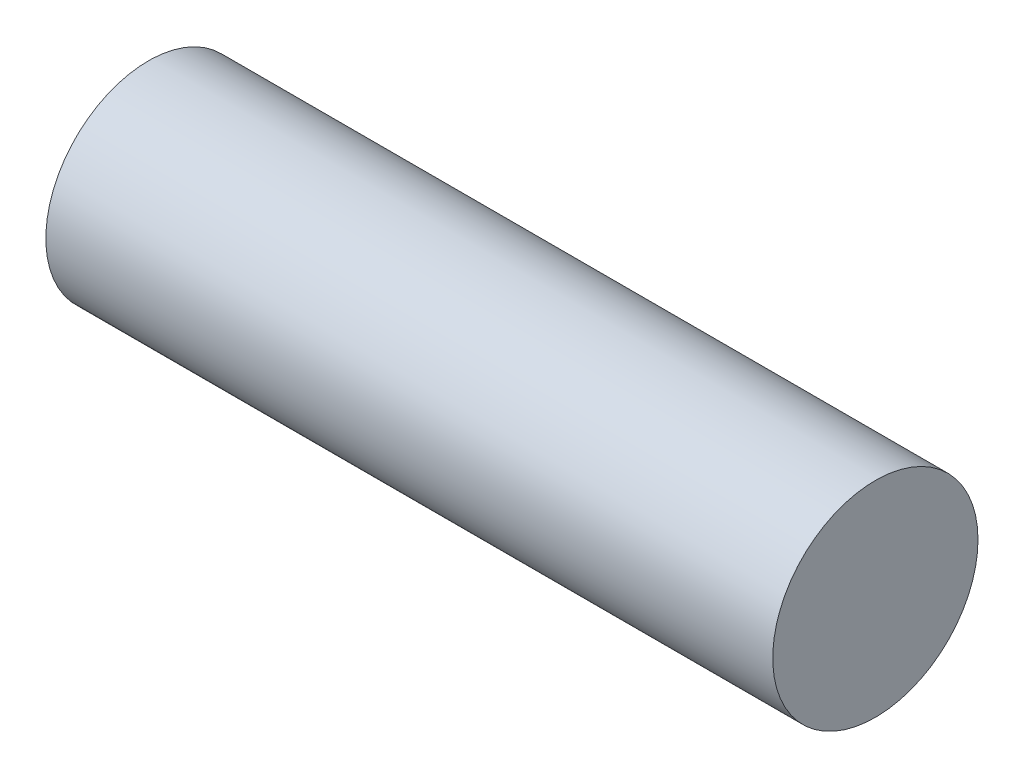
ISO-10303-21;
HEADER;
FILE_DESCRIPTION(('STEP AP214'),'2;1');
FILE_NAME('part.step','',(''),(''),'','','');
FILE_SCHEMA(('AUTOMOTIVE_DESIGN { 1 0 10303 214 1 1 1 1 }'));
ENDSEC;
DATA;
#1=APPLICATION_CONTEXT('core data for automotive mechanical design processes');
#2=APPLICATION_PROTOCOL_DEFINITION('international standard','automotive_design',2000,#1);
#3=PRODUCT_CONTEXT('',#1,'mechanical');
#4=PRODUCT('Part','Part','',(#3));
#5=PRODUCT_RELATED_PRODUCT_CATEGORY('part','',(#4));
#6=PRODUCT_DEFINITION_FORMATION('','',#4);
#7=PRODUCT_DEFINITION_CONTEXT('part definition',#1,'design');
#8=PRODUCT_DEFINITION('design','',#6,#7);
#9=PRODUCT_DEFINITION_SHAPE('','',#8);
#10=(LENGTH_UNIT() NAMED_UNIT(*) SI_UNIT(.MILLI.,.METRE.));
#11=(NAMED_UNIT(*) PLANE_ANGLE_UNIT() SI_UNIT($,.RADIAN.));
#12=(NAMED_UNIT(*) SI_UNIT($,.STERADIAN.) SOLID_ANGLE_UNIT());
#13=UNCERTAINTY_MEASURE_WITH_UNIT(LENGTH_MEASURE(1.E-05),#10,'distance_accuracy_value','');
#14=(GEOMETRIC_REPRESENTATION_CONTEXT(3) GLOBAL_UNCERTAINTY_ASSIGNED_CONTEXT((#13)) GLOBAL_UNIT_ASSIGNED_CONTEXT((#10,
#11,#12)) REPRESENTATION_CONTEXT('',''));
#15=CARTESIAN_POINT('',(0.,0.,0.));
#16=DIRECTION('',(0.,0.,1.));
#17=DIRECTION('',(1.,0.,0.));
#18=AXIS2_PLACEMENT_3D('',#15,#16,#17);
#19=CARTESIAN_POINT('',(31.75,0.,0.));
#20=DIRECTION('',(-1.,0.,0.));
#21=DIRECTION('',(0.,0.,1.));
#22=AXIS2_PLACEMENT_3D('',#19,#20,#21);
#23=CYLINDRICAL_SURFACE('',#22,4.4831);
#24=CARTESIAN_POINT('',(31.75,0.,0.));
#25=DIRECTION('',(1.,0.,0.));
#26=DIRECTION('',(0.,0.,-1.));
#27=AXIS2_PLACEMENT_3D('',#24,#25,#26);
#28=CIRCLE('',#27,4.4831);
#29=CARTESIAN_POINT('',(31.75,0.,-4.4831));
#30=VERTEX_POINT('',#29);
#31=EDGE_CURVE('E10',#30,#30,#28,.T.);
#32=ORIENTED_EDGE('',*,*,#31,.F.);
#33=EDGE_LOOP('',(#32));
#34=FACE_BOUND('',#33,.T.);
#35=CARTESIAN_POINT('',(0.,0.,0.));
#36=DIRECTION('',(1.,0.,0.));
#37=DIRECTION('',(0.,0.,-1.));
#38=AXIS2_PLACEMENT_3D('',#35,#36,#37);
#39=CIRCLE('',#38,4.4831);
#40=CARTESIAN_POINT('',(0.,0.,-4.4831));
#41=VERTEX_POINT('',#40);
#42=EDGE_CURVE('E34',#41,#41,#39,.T.);
#43=ORIENTED_EDGE('',*,*,#42,.T.);
#44=EDGE_LOOP('',(#43));
#45=FACE_BOUND('',#44,.T.);
#46=ADVANCED_FACE('F31',(#34,#45),#23,.T.);
#47=CARTESIAN_POINT('',(31.75,0.,0.));
#48=DIRECTION('',(1.,0.,0.));
#49=DIRECTION('',(0.,0.,-1.));
#50=AXIS2_PLACEMENT_3D('',#47,#48,#49);
#51=PLANE('',#50);
#52=ORIENTED_EDGE('',*,*,#31,.T.);
#53=EDGE_LOOP('',(#52));
#54=FACE_BOUND('',#53,.T.);
#55=ADVANCED_FACE('F46',(#54),#51,.T.);
#56=CARTESIAN_POINT('',(0.,0.,0.));
#57=DIRECTION('',(1.,0.,0.));
#58=DIRECTION('',(0.,0.,-1.));
#59=AXIS2_PLACEMENT_3D('',#56,#57,#58);
#60=PLANE('',#59);
#61=ORIENTED_EDGE('',*,*,#42,.F.);
#62=EDGE_LOOP('',(#61));
#63=FACE_BOUND('',#62,.T.);
#64=ADVANCED_FACE('F44',(#63),#60,.F.);
#65=CLOSED_SHELL('',(#46,#55,#64));
#66=MANIFOLD_SOLID_BREP('B2',#65);
#67=ADVANCED_BREP_SHAPE_REPRESENTATION('',(#18,#66),#14);
#68=SHAPE_DEFINITION_REPRESENTATION(#9,#67);
ENDSEC;
END-ISO-10303-21;
